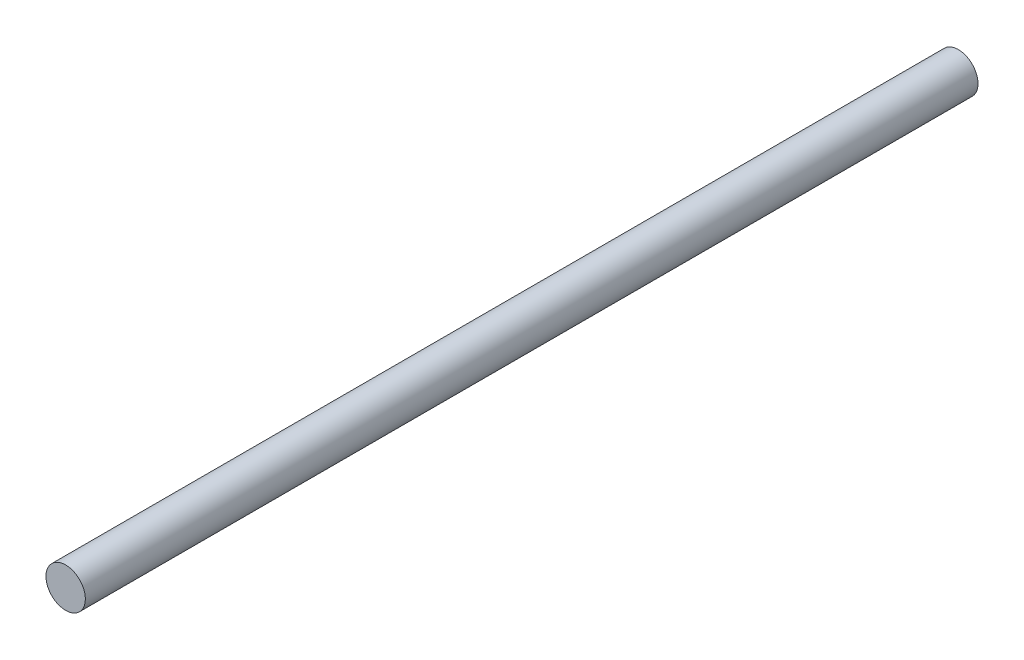
ISO-10303-21;
HEADER;
FILE_DESCRIPTION(('STEP AP214'),'2;1');
FILE_NAME('part.step','',(''),(''),'','','');
FILE_SCHEMA(('AUTOMOTIVE_DESIGN { 1 0 10303 214 1 1 1 1 }'));
ENDSEC;
DATA;
#1=APPLICATION_CONTEXT('core data for automotive mechanical design processes');
#2=APPLICATION_PROTOCOL_DEFINITION('international standard','automotive_design',2000,#1);
#3=PRODUCT_CONTEXT('',#1,'mechanical');
#4=PRODUCT('Part','Part','',(#3));
#5=PRODUCT_RELATED_PRODUCT_CATEGORY('part','',(#4));
#6=PRODUCT_DEFINITION_FORMATION('','',#4);
#7=PRODUCT_DEFINITION_CONTEXT('part definition',#1,'design');
#8=PRODUCT_DEFINITION('design','',#6,#7);
#9=PRODUCT_DEFINITION_SHAPE('','',#8);
#10=(LENGTH_UNIT() NAMED_UNIT(*) SI_UNIT(.MILLI.,.METRE.));
#11=(NAMED_UNIT(*) PLANE_ANGLE_UNIT() SI_UNIT($,.RADIAN.));
#12=(NAMED_UNIT(*) SI_UNIT($,.STERADIAN.) SOLID_ANGLE_UNIT());
#13=UNCERTAINTY_MEASURE_WITH_UNIT(LENGTH_MEASURE(1.E-05),#10,'distance_accuracy_value','');
#14=(GEOMETRIC_REPRESENTATION_CONTEXT(3) GLOBAL_UNCERTAINTY_ASSIGNED_CONTEXT((#13)) GLOBAL_UNIT_ASSIGNED_CONTEXT((#10,
#11,#12)) REPRESENTATION_CONTEXT('',''));
#15=CARTESIAN_POINT('',(0.,0.,0.));
#16=DIRECTION('',(0.,0.,1.));
#17=DIRECTION('',(1.,0.,0.));
#18=AXIS2_PLACEMENT_3D('',#15,#16,#17);
#19=CARTESIAN_POINT('',(0.,0.,68.));
#20=DIRECTION('',(0.,0.,-1.));
#21=DIRECTION('',(-1.,0.,0.));
#22=AXIS2_PLACEMENT_3D('',#19,#20,#21);
#23=CYLINDRICAL_SURFACE('',#22,1.5);
#24=CARTESIAN_POINT('',(0.,0.,68.));
#25=DIRECTION('',(0.,0.,1.));
#26=DIRECTION('',(1.,0.,0.));
#27=AXIS2_PLACEMENT_3D('',#24,#25,#26);
#28=CIRCLE('',#27,1.5);
#29=CARTESIAN_POINT('',(1.5,0.,68.));
#30=VERTEX_POINT('',#29);
#31=EDGE_CURVE('E10',#30,#30,#28,.T.);
#32=ORIENTED_EDGE('',*,*,#31,.F.);
#33=EDGE_LOOP('',(#32));
#34=FACE_BOUND('',#33,.T.);
#35=CARTESIAN_POINT('',(0.,0.,0.));
#36=DIRECTION('',(0.,0.,1.));
#37=DIRECTION('',(1.,0.,0.));
#38=AXIS2_PLACEMENT_3D('',#35,#36,#37);
#39=CIRCLE('',#38,1.5);
#40=CARTESIAN_POINT('',(1.5,0.,0.));
#41=VERTEX_POINT('',#40);
#42=EDGE_CURVE('E40',#41,#41,#39,.T.);
#43=ORIENTED_EDGE('',*,*,#42,.T.);
#44=EDGE_LOOP('',(#43));
#45=FACE_BOUND('',#44,.T.);
#46=ADVANCED_FACE('F37',(#34,#45),#23,.T.);
#47=CARTESIAN_POINT('',(0.,0.,68.));
#48=DIRECTION('',(0.,0.,1.));
#49=DIRECTION('',(1.,0.,0.));
#50=AXIS2_PLACEMENT_3D('',#47,#48,#49);
#51=PLANE('',#50);
#52=ORIENTED_EDGE('',*,*,#31,.T.);
#53=EDGE_LOOP('',(#52));
#54=FACE_BOUND('',#53,.T.);
#55=ADVANCED_FACE('F54',(#54),#51,.T.);
#56=CARTESIAN_POINT('',(0.,0.,0.));
#57=DIRECTION('',(0.,0.,1.));
#58=DIRECTION('',(1.,0.,0.));
#59=AXIS2_PLACEMENT_3D('',#56,#57,#58);
#60=PLANE('',#59);
#61=ORIENTED_EDGE('',*,*,#42,.F.);
#62=EDGE_LOOP('',(#61));
#63=FACE_BOUND('',#62,.T.);
#64=ADVANCED_FACE('F52',(#63),#60,.F.);
#65=CLOSED_SHELL('',(#46,#55,#64));
#66=MANIFOLD_SOLID_BREP('B2',#65);
#67=ADVANCED_BREP_SHAPE_REPRESENTATION('',(#18,#66),#14);
#68=SHAPE_DEFINITION_REPRESENTATION(#9,#67);
ENDSEC;
END-ISO-10303-21;
